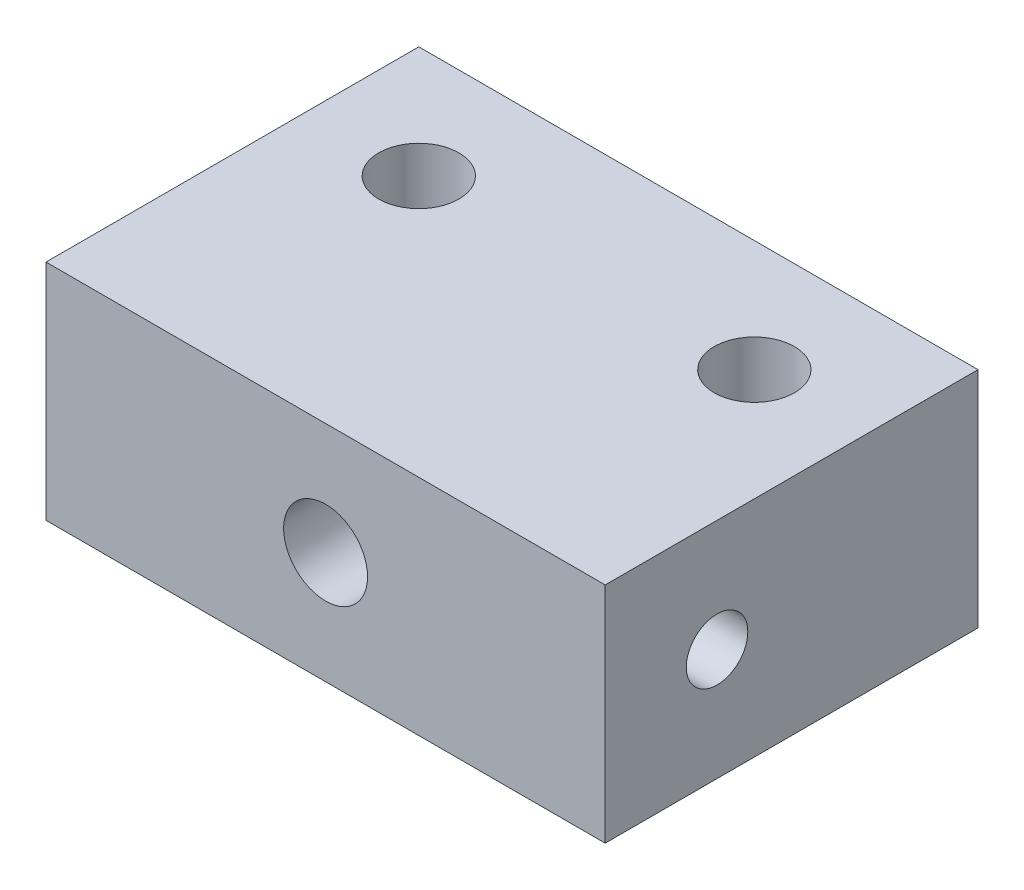
ISO-10303-21;
HEADER;
FILE_DESCRIPTION(('STEP AP214'),'2;1');
FILE_NAME('part.step','',(''),(''),'','','');
FILE_SCHEMA(('AUTOMOTIVE_DESIGN { 1 0 10303 214 1 1 1 1 }'));
ENDSEC;
DATA;
#1=APPLICATION_CONTEXT('core data for automotive mechanical design processes');
#2=APPLICATION_PROTOCOL_DEFINITION('international standard','automotive_design',2000,#1);
#3=PRODUCT_CONTEXT('',#1,'mechanical');
#4=PRODUCT('Part','Part','',(#3));
#5=PRODUCT_RELATED_PRODUCT_CATEGORY('part','',(#4));
#6=PRODUCT_DEFINITION_FORMATION('','',#4);
#7=PRODUCT_DEFINITION_CONTEXT('part definition',#1,'design');
#8=PRODUCT_DEFINITION('design','',#6,#7);
#9=PRODUCT_DEFINITION_SHAPE('','',#8);
#10=(LENGTH_UNIT() NAMED_UNIT(*) SI_UNIT(.MILLI.,.METRE.));
#11=(NAMED_UNIT(*) PLANE_ANGLE_UNIT() SI_UNIT($,.RADIAN.));
#12=(NAMED_UNIT(*) SI_UNIT($,.STERADIAN.) SOLID_ANGLE_UNIT());
#13=UNCERTAINTY_MEASURE_WITH_UNIT(LENGTH_MEASURE(1.E-05),#10,'distance_accuracy_value','');
#14=(GEOMETRIC_REPRESENTATION_CONTEXT(3) GLOBAL_UNCERTAINTY_ASSIGNED_CONTEXT((#13)) GLOBAL_UNIT_ASSIGNED_CONTEXT((#10,
#11,#12)) REPRESENTATION_CONTEXT('',''));
#15=CARTESIAN_POINT('',(0.,0.,0.));
#16=DIRECTION('',(0.,0.,1.));
#17=DIRECTION('',(1.,0.,0.));
#18=AXIS2_PLACEMENT_3D('',#15,#16,#17);
#19=CARTESIAN_POINT('',(15.,0.,4.));
#20=DIRECTION('',(1.,0.,0.));
#21=DIRECTION('',(0.,0.,-1.));
#22=AXIS2_PLACEMENT_3D('',#19,#20,#21);
#23=CYLINDRICAL_SURFACE('',#22,1.64999999999999);
#24=CARTESIAN_POINT('',(2.24999999999999,0.,2.35000000000001));
#25=CARTESIAN_POINT('',(2.24999381385539,-0.0810313457488243,2.35000646243822));
#26=CARTESIAN_POINT('',(2.24557772350229,-0.16216312041223,2.35601476654127));
#27=CARTESIAN_POINT('',(2.22831565262839,-0.321859784676778,2.37967490389228));
#28=CARTESIAN_POINT('',(2.21545312282856,-0.400419316533134,2.39734959568061));
#29=CARTESIAN_POINT('',(2.18254266653746,-0.552278539991193,2.44316200012965));
#30=CARTESIAN_POINT('',(2.16253614926497,-0.625605680848936,2.47123944906145));
#31=CARTESIAN_POINT('',(2.11686292416082,-0.766063665025606,2.53656128797816));
#32=CARTESIAN_POINT('',(2.09119709701189,-0.833195470138592,2.57380425176112));
#33=CARTESIAN_POINT('',(2.03332947824902,-0.966337940887495,2.66002002177325));
#34=CARTESIAN_POINT('',(2.00074481564817,-1.03168607871457,2.70975352959745));
#35=CARTESIAN_POINT('',(1.93297687470046,-1.15368201193868,2.81756243536801));
#36=CARTESIAN_POINT('',(1.89778965397867,-1.21031619045114,2.87565062017348));
#37=CARTESIAN_POINT('',(1.82032302518825,-1.32459659823452,3.0114202516156));
#38=CARTESIAN_POINT('',(1.77799391182851,-1.38030170191106,3.09071573999115));
#39=CARTESIAN_POINT('',(1.69786308636531,-1.47774276372248,3.25956249568835));
#40=CARTESIAN_POINT('',(1.66005473056948,-1.51949938662037,3.34909832530882));
#41=CARTESIAN_POINT('',(1.60632388084195,-1.57581950437787,3.50629459970162));
#42=CARTESIAN_POINT('',(1.5873071001032,-1.59480773647515,3.57129759323594));
#43=CARTESIAN_POINT('',(1.55659712234634,-1.62479879602515,3.70473151687217));
#44=CARTESIAN_POINT('',(1.544887462994,-1.63581958241999,3.77315436362935));
#45=CARTESIAN_POINT('',(1.53064274823367,-1.64916353822089,3.91238417550549));
#46=CARTESIAN_POINT('',(1.52817896414055,-1.65141914644185,3.98320543195618));
#47=CARTESIAN_POINT('',(1.5331183075901,-1.64683175479871,4.12422362929995));
#48=CARTESIAN_POINT('',(1.54052819687183,-1.63998251971732,4.19442010917798));
#49=CARTESIAN_POINT('',(1.56509667632078,-1.61656394557398,4.33940034903482));
#50=CARTESIAN_POINT('',(1.58322729672588,-1.59901906139457,4.41385345844061));
#51=CARTESIAN_POINT('',(1.62675933857284,-1.55470663491056,4.55775054873146));
#52=CARTESIAN_POINT('',(1.65217786292629,-1.52791736786161,4.62718225997157));
#53=CARTESIAN_POINT('',(1.71685252849678,-1.4553418329475,4.78378522647736));
#54=CARTESIAN_POINT('',(1.75783963322173,-1.40618840134296,4.86867218352675));
#55=CARTESIAN_POINT('',(1.8417600947872,-1.29434522013679,5.02793483228883));
#56=CARTESIAN_POINT('',(1.88469556428074,-1.23164048542208,5.10229873568162));
#57=CARTESIAN_POINT('',(1.96873902272568,-1.09237400793865,5.24055386478937));
#58=CARTESIAN_POINT('',(2.00981334518457,-1.01563189246383,5.30428528132508));
#59=CARTESIAN_POINT('',(2.08536715797627,-0.849709043259193,5.41793869508472));
#60=CARTESIAN_POINT('',(2.1198596057374,-0.760553359094809,5.46788791302086));
#61=CARTESIAN_POINT('',(2.17092254026151,-0.595843940372023,5.54057918629625));
#62=CARTESIAN_POINT('',(2.18982038546683,-0.522632134340639,5.56701182218385));
#63=CARTESIAN_POINT('',(2.22037725737713,-0.371882781737124,5.60943953485053));
#64=CARTESIAN_POINT('',(2.2320539657079,-0.294356311990669,5.62546011146915));
#65=CARTESIAN_POINT('',(2.24306735210819,-0.180116891709193,5.64053618366883));
#66=CARTESIAN_POINT('',(2.24566055234252,-0.144244427971315,5.64407846760258));
#67=CARTESIAN_POINT('',(2.24912844618745,-0.0722546691468024,5.64881207738096));
#68=CARTESIAN_POINT('',(2.25000275881756,-0.036137321562845,5.65000288203546));
#69=CARTESIAN_POINT('',(2.24999381385547,0.0810313457488059,5.64999353756188));
#70=CARTESIAN_POINT('',(2.24557772350231,0.162163120412209,5.64398523345876));
#71=CARTESIAN_POINT('',(2.22831565262837,0.321859784676762,5.62032509610769));
#72=CARTESIAN_POINT('',(2.21545312282856,0.400419316533125,5.60265040431938));
#73=CARTESIAN_POINT('',(2.18254266653746,0.552278539991194,5.55683799987035));
#74=CARTESIAN_POINT('',(2.16253614926497,0.625605680848939,5.52876055093855));
#75=CARTESIAN_POINT('',(2.11686292416082,0.766063665025609,5.46343871202183));
#76=CARTESIAN_POINT('',(2.09119709701189,0.833195470138593,5.42619574823888));
#77=CARTESIAN_POINT('',(2.03332947824902,0.966337940887493,5.33997997822674));
#78=CARTESIAN_POINT('',(2.00074481564817,1.03168607871456,5.29024647040254));
#79=CARTESIAN_POINT('',(1.93297687470046,1.15368201193868,5.18243756463198));
#80=CARTESIAN_POINT('',(1.89778965397867,1.21031619045114,5.12434937982652));
#81=CARTESIAN_POINT('',(1.82032302518825,1.32459659823452,4.98857974838439));
#82=CARTESIAN_POINT('',(1.77799391182851,1.38030170191105,4.90928426000885));
#83=CARTESIAN_POINT('',(1.69786308636531,1.47774276372248,4.74043750431165));
#84=CARTESIAN_POINT('',(1.66005473056948,1.51949938662037,4.65090167469117));
#85=CARTESIAN_POINT('',(1.60632388084196,1.57581950437787,4.49370540029838));
#86=CARTESIAN_POINT('',(1.58730710010321,1.59480773647515,4.42870240676405));
#87=CARTESIAN_POINT('',(1.55659712234635,1.62479879602515,4.29526848312783));
#88=CARTESIAN_POINT('',(1.54488746299401,1.63581958241998,4.22684563637064));
#89=CARTESIAN_POINT('',(1.53064274823367,1.64916353822089,4.0876158244945));
#90=CARTESIAN_POINT('',(1.52817896414056,1.65141914644184,4.01679456804381));
#91=CARTESIAN_POINT('',(1.53311830759011,1.6468317547987,3.87577637070005));
#92=CARTESIAN_POINT('',(1.54052819687183,1.63998251971732,3.80557989082202));
#93=CARTESIAN_POINT('',(1.56509667632079,1.61656394557398,3.66059965096517));
#94=CARTESIAN_POINT('',(1.58322729672589,1.59901906139456,3.58614654155938));
#95=CARTESIAN_POINT('',(1.62675933857285,1.55470663491055,3.44224945126853));
#96=CARTESIAN_POINT('',(1.6521778629263,1.52791736786161,3.37281774002842));
#97=CARTESIAN_POINT('',(1.71685252849679,1.45534183294749,3.21621477352263));
#98=CARTESIAN_POINT('',(1.75783963322174,1.40618840134295,3.13132781647324));
#99=CARTESIAN_POINT('',(1.84176009478721,1.29434522013678,2.97206516771116));
#100=CARTESIAN_POINT('',(1.88469556428075,1.23164048542207,2.89770126431837));
#101=CARTESIAN_POINT('',(1.96873902272568,1.09237400793864,2.75944613521062));
#102=CARTESIAN_POINT('',(2.00981334518457,1.01563189246382,2.69571471867491));
#103=CARTESIAN_POINT('',(2.08536715797627,0.849709043259181,2.58206130491527));
#104=CARTESIAN_POINT('',(2.11985960573741,0.760553359094794,2.53211208697913));
#105=CARTESIAN_POINT('',(2.17092254026152,0.595843940372003,2.45942081370375));
#106=CARTESIAN_POINT('',(2.18982038546684,0.522632134340616,2.43298817781615));
#107=CARTESIAN_POINT('',(2.22037725737714,0.371882781737101,2.39056046514947));
#108=CARTESIAN_POINT('',(2.2320539657079,0.294356311990648,2.37453988853086));
#109=CARTESIAN_POINT('',(2.2430673521082,0.180116891709177,2.35946381633116));
#110=CARTESIAN_POINT('',(2.24566055234253,0.1442444279713,2.3559215323974));
#111=CARTESIAN_POINT('',(2.24912844618744,0.0722546691467887,2.35118792261905));
#112=CARTESIAN_POINT('',(2.25000275881752,0.0361373215628304,2.3499971179646));
#113=CARTESIAN_POINT('',(2.24999999999999,0.,2.35000000000001));
#114=B_SPLINE_CURVE_WITH_KNOTS('',3,(#24,#25,#26,#27,#28,#29,#30,#31,#32,#33,#34,#35,#36,#37,
#38,#39,#40,#41,#42,#43,#44,#45,#46,#47,#48,#49,#50,#51,#52,#53,#54,#55,#56,#57,#58,#59,#60,#61,
#62,#63,#64,#65,#66,#67,#68,#69,#70,#71,#72,#73,#74,#75,#76,#77,#78,#79,#80,#81,#82,#83,#84,#85,
#86,#87,#88,#89,#90,#91,#92,#93,#94,#95,#96,#97,#98,#99,#100,#101,#102,#103,#104,#105,#106,#107,
#108,#109,#110,#111,#112,#113),.UNSPECIFIED.,.T.,.F.,(4,2,2,2,2,2,2,2,2,2,2,2,2,2,2,2,2,2,2,2,2,
2,2,2,2,2,2,2,2,2,2,2,2,2,2,2,2,2,2,2,2,2,2,2,4),(0.,0.24293991541706,0.48635725386847,
0.72838596633409,0.970377041654618,1.23447235150839,1.49897624834313,1.81486929392013,
2.13029224456471,2.34056736662706,2.55036702969089,2.76178063856469,2.97333910321244,
3.20789135785872,3.44299861833375,3.76030004827092,4.07795416397842,4.40002040674047,
4.72144591941894,4.96077617539,5.19951806427571,5.30783729012432,5.41618052153364,
5.6591204369507,5.90253777540213,6.14456648786776,6.38655756318828,6.65065287304205,
6.91515676987679,7.2310498154538,7.54647276609838,7.75674788816072,7.96654755122455,
8.17796116009835,8.3895196247461,8.62407187939239,8.85917913986742,9.17648056980459,
9.4941346855121,9.81620092827414,10.1376264409526,10.3769566969237,10.6156985858094,
10.724017811658,10.8323610430673),.UNSPECIFIED.);
#115=CARTESIAN_POINT('',(2.24999999999999,0.,2.35000000000001));
#116=VERTEX_POINT('',#115);
#117=EDGE_CURVE('E20',#116,#116,#114,.T.);
#118=ORIENTED_EDGE('',*,*,#117,.T.);
#119=EDGE_LOOP('',(#118));
#120=FACE_BOUND('',#119,.T.);
#121=CARTESIAN_POINT('',(15.,0.,4.));
#122=DIRECTION('',(1.,0.,0.));
#123=DIRECTION('',(0.,0.,-1.));
#124=AXIS2_PLACEMENT_3D('',#121,#122,#123);
#125=CIRCLE('',#124,1.64999999999999);
#126=CARTESIAN_POINT('',(15.,0.,2.35000000000001));
#127=VERTEX_POINT('',#126);
#128=EDGE_CURVE('E85',#127,#127,#125,.T.);
#129=ORIENTED_EDGE('',*,*,#128,.T.);
#130=EDGE_LOOP('',(#129));
#131=FACE_BOUND('',#130,.T.);
#132=ADVANCED_FACE('F16',(#120,#131),#23,.F.);
#133=CARTESIAN_POINT('',(-15.,6.,10.));
#134=DIRECTION('',(0.,-1.,0.));
#135=DIRECTION('',(1.,0.,0.));
#136=AXIS2_PLACEMENT_3D('',#133,#134,#135);
#137=PLANE('',#136);
#138=DIRECTION('',(0.,0.,1.));
#139=VECTOR('',#138,1.);
#140=CARTESIAN_POINT('',(-15.,6.,10.));
#141=LINE('',#140,#139);
#142=CARTESIAN_POINT('',(-15.,6.,-10.));
#143=VERTEX_POINT('',#142);
#144=CARTESIAN_POINT('',(-15.,6.,10.));
#145=VERTEX_POINT('',#144);
#146=EDGE_CURVE('E73',#143,#145,#141,.T.);
#147=ORIENTED_EDGE('',*,*,#146,.T.);
#148=DIRECTION('',(-1.,0.,0.));
#149=VECTOR('',#148,1.);
#150=CARTESIAN_POINT('',(-15.,6.,10.));
#151=LINE('',#150,#149);
#152=CARTESIAN_POINT('',(15.,6.,10.));
#153=VERTEX_POINT('',#152);
#154=EDGE_CURVE('E59',#145,#153,#151,.F.);
#155=ORIENTED_EDGE('',*,*,#154,.T.);
#156=DIRECTION('',(0.,0.,1.));
#157=VECTOR('',#156,1.);
#158=CARTESIAN_POINT('',(15.,5.99999999999999,10.));
#159=LINE('',#158,#157);
#160=CARTESIAN_POINT('',(15.,6.,-10.));
#161=VERTEX_POINT('',#160);
#162=EDGE_CURVE('E259',#153,#161,#159,.F.);
#163=ORIENTED_EDGE('',*,*,#162,.T.);
#164=DIRECTION('',(-1.,0.,0.));
#165=VECTOR('',#164,1.);
#166=CARTESIAN_POINT('',(-15.,6.,-10.));
#167=LINE('',#166,#165);
#168=EDGE_CURVE('E76',#143,#161,#167,.F.);
#169=ORIENTED_EDGE('',*,*,#168,.F.);
#170=EDGE_LOOP('',(#147,#155,#163,#169));
#171=FACE_BOUND('',#170,.T.);
#172=CARTESIAN_POINT('',(9.00000000000001,6.,-4.));
#173=DIRECTION('',(0.,1.,0.));
#174=DIRECTION('',(0.,0.,1.));
#175=AXIS2_PLACEMENT_3D('',#172,#173,#174);
#176=CIRCLE('',#175,2.15);
#177=CARTESIAN_POINT('',(9.00000000000001,6.,-1.85));
#178=VERTEX_POINT('',#177);
#179=EDGE_CURVE('E80',#178,#178,#176,.F.);
#180=ORIENTED_EDGE('',*,*,#179,.T.);
#181=EDGE_LOOP('',(#180));
#182=FACE_BOUND('',#181,.T.);
#183=CARTESIAN_POINT('',(-9.,6.,-4.));
#184=DIRECTION('',(0.,1.,0.));
#185=DIRECTION('',(0.,0.,1.));
#186=AXIS2_PLACEMENT_3D('',#183,#184,#185);
#187=CIRCLE('',#186,2.15);
#188=CARTESIAN_POINT('',(-9.,6.,-1.85));
#189=VERTEX_POINT('',#188);
#190=EDGE_CURVE('E104',#189,#189,#187,.F.);
#191=ORIENTED_EDGE('',*,*,#190,.T.);
#192=EDGE_LOOP('',(#191));
#193=FACE_BOUND('',#192,.T.);
#194=ADVANCED_FACE('F74',(#171,#182,#193),#137,.F.);
#195=CARTESIAN_POINT('',(0.,0.,10.));
#196=DIRECTION('',(0.,0.,1.));
#197=DIRECTION('',(1.,0.,0.));
#198=AXIS2_PLACEMENT_3D('',#195,#196,#197);
#199=CYLINDRICAL_SURFACE('',#198,2.24999999999999);
#200=ORIENTED_EDGE('',*,*,#117,.F.);
#201=EDGE_LOOP('',(#200));
#202=FACE_BOUND('',#201,.T.);
#203=CARTESIAN_POINT('',(0.,0.,10.));
#204=DIRECTION('',(0.,0.,1.));
#205=DIRECTION('',(1.,0.,0.));
#206=AXIS2_PLACEMENT_3D('',#203,#204,#205);
#207=CIRCLE('',#206,2.24999999999999);
#208=CARTESIAN_POINT('',(2.24999999999999,0.,10.));
#209=VERTEX_POINT('',#208);
#210=EDGE_CURVE('E70',#209,#209,#207,.T.);
#211=ORIENTED_EDGE('',*,*,#210,.T.);
#212=EDGE_LOOP('',(#211));
#213=FACE_BOUND('',#212,.T.);
#214=CARTESIAN_POINT('',(0.,0.,-10.));
#215=DIRECTION('',(0.,0.,1.));
#216=DIRECTION('',(1.,0.,0.));
#217=AXIS2_PLACEMENT_3D('',#214,#215,#216);
#218=CIRCLE('',#217,2.24999999999999);
#219=CARTESIAN_POINT('',(2.24999999999999,0.,-10.));
#220=VERTEX_POINT('',#219);
#221=EDGE_CURVE('E98',#220,#220,#218,.T.);
#222=ORIENTED_EDGE('',*,*,#221,.F.);
#223=EDGE_LOOP('',(#222));
#224=FACE_BOUND('',#223,.T.);
#225=ADVANCED_FACE('F113',(#202,#213,#224),#199,.F.);
#226=CARTESIAN_POINT('',(-9.,6.,-4.));
#227=DIRECTION('',(0.,1.,0.));
#228=DIRECTION('',(0.,0.,1.));
#229=AXIS2_PLACEMENT_3D('',#226,#227,#228);
#230=CYLINDRICAL_SURFACE('',#229,2.15);
#231=CARTESIAN_POINT('',(-9.,-6.,-4.));
#232=DIRECTION('',(0.,1.,0.));
#233=DIRECTION('',(0.,0.,1.));
#234=AXIS2_PLACEMENT_3D('',#231,#232,#233);
#235=CIRCLE('',#234,2.15);
#236=CARTESIAN_POINT('',(-9.,-6.,-1.85));
#237=VERTEX_POINT('',#236);
#238=EDGE_CURVE('E95',#237,#237,#235,.F.);
#239=ORIENTED_EDGE('',*,*,#238,.T.);
#240=EDGE_LOOP('',(#239));
#241=FACE_BOUND('',#240,.T.);
#242=ORIENTED_EDGE('',*,*,#190,.F.);
#243=EDGE_LOOP('',(#242));
#244=FACE_BOUND('',#243,.T.);
#245=ADVANCED_FACE('F116',(#241,#244),#230,.F.);
#246=CARTESIAN_POINT('',(9.00000000000001,6.,-4.));
#247=DIRECTION('',(0.,1.,0.));
#248=DIRECTION('',(0.,0.,1.));
#249=AXIS2_PLACEMENT_3D('',#246,#247,#248);
#250=CYLINDRICAL_SURFACE('',#249,2.15);
#251=CARTESIAN_POINT('',(9.00000000000001,-6.,-4.));
#252=DIRECTION('',(0.,1.,0.));
#253=DIRECTION('',(0.,0.,1.));
#254=AXIS2_PLACEMENT_3D('',#251,#252,#253);
#255=CIRCLE('',#254,2.15);
#256=CARTESIAN_POINT('',(9.00000000000001,-6.,-1.85));
#257=VERTEX_POINT('',#256);
#258=EDGE_CURVE('E92',#257,#257,#255,.F.);
#259=ORIENTED_EDGE('',*,*,#258,.T.);
#260=EDGE_LOOP('',(#259));
#261=FACE_BOUND('',#260,.T.);
#262=ORIENTED_EDGE('',*,*,#179,.F.);
#263=EDGE_LOOP('',(#262));
#264=FACE_BOUND('',#263,.T.);
#265=ADVANCED_FACE('F140',(#261,#264),#250,.F.);
#266=CARTESIAN_POINT('',(-15.,-6.,10.));
#267=DIRECTION('',(1.,0.,0.));
#268=DIRECTION('',(0.,1.,0.));
#269=AXIS2_PLACEMENT_3D('',#266,#267,#268);
#270=PLANE('',#269);
#271=DIRECTION('',(0.,0.,1.));
#272=VECTOR('',#271,1.);
#273=CARTESIAN_POINT('',(-15.,-6.,10.));
#274=LINE('',#273,#272);
#275=CARTESIAN_POINT('',(-15.,-6.,-10.));
#276=VERTEX_POINT('',#275);
#277=CARTESIAN_POINT('',(-15.,-6.,10.));
#278=VERTEX_POINT('',#277);
#279=EDGE_CURVE('E84',#276,#278,#274,.T.);
#280=ORIENTED_EDGE('',*,*,#279,.T.);
#281=DIRECTION('',(0.,1.,0.));
#282=VECTOR('',#281,1.);
#283=CARTESIAN_POINT('',(-15.,-6.,10.));
#284=LINE('',#283,#282);
#285=EDGE_CURVE('E67',#278,#145,#284,.T.);
#286=ORIENTED_EDGE('',*,*,#285,.T.);
#287=ORIENTED_EDGE('',*,*,#146,.F.);
#288=DIRECTION('',(0.,1.,0.));
#289=VECTOR('',#288,1.);
#290=CARTESIAN_POINT('',(-15.,-6.,-10.));
#291=LINE('',#290,#289);
#292=EDGE_CURVE('E263',#276,#143,#291,.T.);
#293=ORIENTED_EDGE('',*,*,#292,.F.);
#294=EDGE_LOOP('',(#280,#286,#287,#293));
#295=FACE_BOUND('',#294,.T.);
#296=ADVANCED_FACE('F83',(#295),#270,.F.);
#297=CARTESIAN_POINT('',(-15.,-6.,10.));
#298=DIRECTION('',(0.,0.,-1.));
#299=DIRECTION('',(-1.,0.,0.));
#300=AXIS2_PLACEMENT_3D('',#297,#298,#299);
#301=PLANE('',#300);
#302=DIRECTION('',(1.,0.,0.));
#303=VECTOR('',#302,1.);
#304=CARTESIAN_POINT('',(-15.,-6.,10.));
#305=LINE('',#304,#303);
#306=CARTESIAN_POINT('',(15.,-6.,10.));
#307=VERTEX_POINT('',#306);
#308=EDGE_CURVE('E269',#278,#307,#305,.T.);
#309=ORIENTED_EDGE('',*,*,#308,.T.);
#310=DIRECTION('',(0.,-1.,0.));
#311=VECTOR('',#310,1.);
#312=CARTESIAN_POINT('',(15.,-6.,10.));
#313=LINE('',#312,#311);
#314=EDGE_CURVE('E69',#307,#153,#313,.F.);
#315=ORIENTED_EDGE('',*,*,#314,.T.);
#316=ORIENTED_EDGE('',*,*,#154,.F.);
#317=ORIENTED_EDGE('',*,*,#285,.F.);
#318=EDGE_LOOP('',(#309,#315,#316,#317));
#319=FACE_BOUND('',#318,.T.);
#320=ORIENTED_EDGE('',*,*,#210,.F.);
#321=EDGE_LOOP('',(#320));
#322=FACE_BOUND('',#321,.T.);
#323=ADVANCED_FACE('F64',(#319,#322),#301,.F.);
#324=CARTESIAN_POINT('',(15.,-6.,10.));
#325=DIRECTION('',(-1.,0.,0.));
#326=DIRECTION('',(0.,-1.,0.));
#327=AXIS2_PLACEMENT_3D('',#324,#325,#326);
#328=PLANE('',#327);
#329=ORIENTED_EDGE('',*,*,#162,.F.);
#330=ORIENTED_EDGE('',*,*,#314,.F.);
#331=DIRECTION('',(0.,0.,1.));
#332=VECTOR('',#331,1.);
#333=CARTESIAN_POINT('',(15.,-6.,10.));
#334=LINE('',#333,#332);
#335=CARTESIAN_POINT('',(15.,-6.,-10.));
#336=VERTEX_POINT('',#335);
#337=EDGE_CURVE('E30',#307,#336,#334,.F.);
#338=ORIENTED_EDGE('',*,*,#337,.T.);
#339=DIRECTION('',(0.,1.,0.));
#340=VECTOR('',#339,1.);
#341=CARTESIAN_POINT('',(15.,-6.,-10.));
#342=LINE('',#341,#340);
#343=EDGE_CURVE('E38',#161,#336,#342,.F.);
#344=ORIENTED_EDGE('',*,*,#343,.F.);
#345=EDGE_LOOP('',(#329,#330,#338,#344));
#346=FACE_BOUND('',#345,.T.);
#347=ORIENTED_EDGE('',*,*,#128,.F.);
#348=EDGE_LOOP('',(#347));
#349=FACE_BOUND('',#348,.T.);
#350=ADVANCED_FACE('F124',(#346,#349),#328,.F.);
#351=CARTESIAN_POINT('',(-15.,-6.,-10.));
#352=DIRECTION('',(0.,0.,-1.));
#353=DIRECTION('',(-1.,0.,0.));
#354=AXIS2_PLACEMENT_3D('',#351,#352,#353);
#355=PLANE('',#354);
#356=ORIENTED_EDGE('',*,*,#221,.T.);
#357=EDGE_LOOP('',(#356));
#358=FACE_BOUND('',#357,.T.);
#359=ORIENTED_EDGE('',*,*,#343,.T.);
#360=DIRECTION('',(1.,0.,0.));
#361=VECTOR('',#360,1.);
#362=CARTESIAN_POINT('',(-15.,-6.,-10.));
#363=LINE('',#362,#361);
#364=EDGE_CURVE('E11',#336,#276,#363,.F.);
#365=ORIENTED_EDGE('',*,*,#364,.T.);
#366=ORIENTED_EDGE('',*,*,#292,.T.);
#367=ORIENTED_EDGE('',*,*,#168,.T.);
#368=EDGE_LOOP('',(#359,#365,#366,#367));
#369=FACE_BOUND('',#368,.T.);
#370=ADVANCED_FACE('F121',(#358,#369),#355,.T.);
#371=CARTESIAN_POINT('',(-15.,-6.,10.));
#372=DIRECTION('',(0.,1.,0.));
#373=DIRECTION('',(0.,0.,1.));
#374=AXIS2_PLACEMENT_3D('',#371,#372,#373);
#375=PLANE('',#374);
#376=ORIENTED_EDGE('',*,*,#337,.F.);
#377=ORIENTED_EDGE('',*,*,#308,.F.);
#378=ORIENTED_EDGE('',*,*,#279,.F.);
#379=ORIENTED_EDGE('',*,*,#364,.F.);
#380=EDGE_LOOP('',(#376,#377,#378,#379));
#381=FACE_BOUND('',#380,.T.);
#382=ORIENTED_EDGE('',*,*,#258,.F.);
#383=EDGE_LOOP('',(#382));
#384=FACE_BOUND('',#383,.T.);
#385=ORIENTED_EDGE('',*,*,#238,.F.);
#386=EDGE_LOOP('',(#385));
#387=FACE_BOUND('',#386,.T.);
#388=ADVANCED_FACE('F123',(#381,#384,#387),#375,.F.);
#389=CLOSED_SHELL('',(#132,#194,#225,#245,#265,#296,#323,#350,#370,#388));
#390=MANIFOLD_SOLID_BREP('B1',#389);
#391=ADVANCED_BREP_SHAPE_REPRESENTATION('',(#18,#390),#14);
#392=SHAPE_DEFINITION_REPRESENTATION(#9,#391);
ENDSEC;
END-ISO-10303-21;
